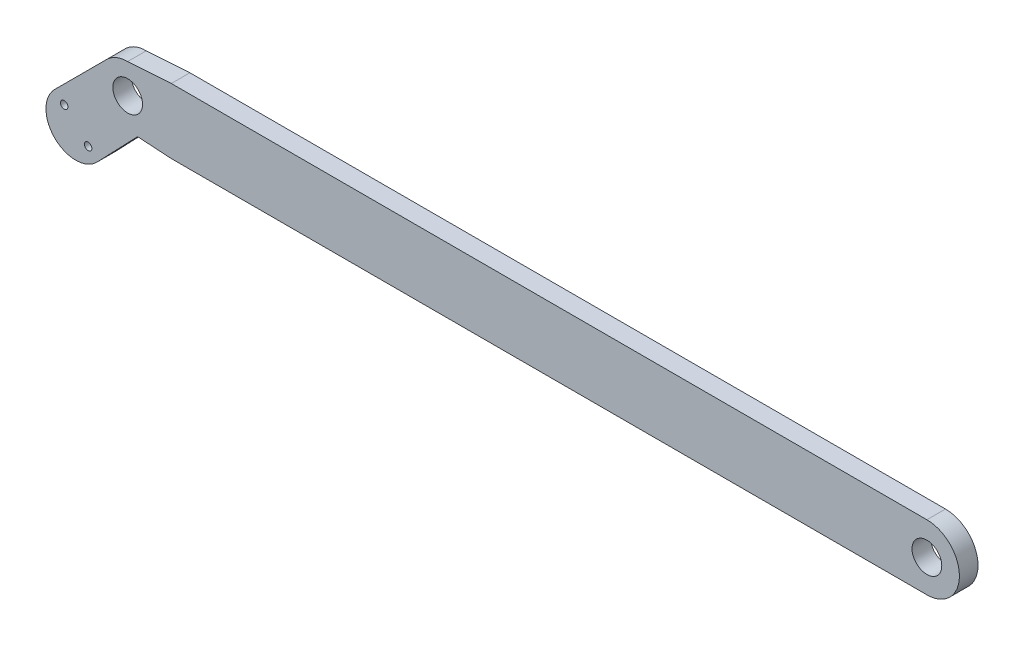
ISO-10303-21;
HEADER;
FILE_DESCRIPTION(('STEP AP214'),'2;1');
FILE_NAME('part.step','',(''),(''),'','','');
FILE_SCHEMA(('AUTOMOTIVE_DESIGN { 1 0 10303 214 1 1 1 1 }'));
ENDSEC;
DATA;
#1=APPLICATION_CONTEXT('core data for automotive mechanical design processes');
#2=APPLICATION_PROTOCOL_DEFINITION('international standard','automotive_design',2000,#1);
#3=PRODUCT_CONTEXT('',#1,'mechanical');
#4=PRODUCT('Part','Part','',(#3));
#5=PRODUCT_RELATED_PRODUCT_CATEGORY('part','',(#4));
#6=PRODUCT_DEFINITION_FORMATION('','',#4);
#7=PRODUCT_DEFINITION_CONTEXT('part definition',#1,'design');
#8=PRODUCT_DEFINITION('design','',#6,#7);
#9=PRODUCT_DEFINITION_SHAPE('','',#8);
#10=(LENGTH_UNIT() NAMED_UNIT(*) SI_UNIT(.MILLI.,.METRE.));
#11=(NAMED_UNIT(*) PLANE_ANGLE_UNIT() SI_UNIT($,.RADIAN.));
#12=(NAMED_UNIT(*) SI_UNIT($,.STERADIAN.) SOLID_ANGLE_UNIT());
#13=UNCERTAINTY_MEASURE_WITH_UNIT(LENGTH_MEASURE(1.E-05),#10,'distance_accuracy_value','');
#14=(GEOMETRIC_REPRESENTATION_CONTEXT(3) GLOBAL_UNCERTAINTY_ASSIGNED_CONTEXT((#13)) GLOBAL_UNIT_ASSIGNED_CONTEXT((#10,
#11,#12)) REPRESENTATION_CONTEXT('',''));
#15=CARTESIAN_POINT('',(0.,0.,0.));
#16=DIRECTION('',(0.,0.,1.));
#17=DIRECTION('',(1.,0.,0.));
#18=AXIS2_PLACEMENT_3D('',#15,#16,#17);
#19=CARTESIAN_POINT('',(-11.7408320292823,0.,5.));
#20=DIRECTION('',(0.,0.,-1.));
#21=DIRECTION('',(-1.,0.,0.));
#22=AXIS2_PLACEMENT_3D('',#19,#20,#21);
#23=CYLINDRICAL_SURFACE('',#22,8.);
#24=DIRECTION('',(0.,0.,-1.));
#25=VECTOR('',#24,1.);
#26=CARTESIAN_POINT('',(-17.4000667674121,5.65447275868802,5.));
#27=LINE('',#26,#25);
#28=CARTESIAN_POINT('',(-17.4000667674121,5.65447275868802,5.));
#29=VERTEX_POINT('',#28);
#30=CARTESIAN_POINT('',(-17.4000667674121,5.65447275868802,0.));
#31=VERTEX_POINT('',#30);
#32=EDGE_CURVE('E175',#29,#31,#27,.T.);
#33=ORIENTED_EDGE('',*,*,#32,.F.);
#34=CARTESIAN_POINT('',(-11.7408320292823,0.,5.));
#35=DIRECTION('',(0.,0.,1.));
#36=DIRECTION('',(1.,0.,0.));
#37=AXIS2_PLACEMENT_3D('',#34,#35,#36);
#38=CIRCLE('',#37,8.);
#39=CARTESIAN_POINT('',(-11.7408320292823,8.,5.));
#40=VERTEX_POINT('',#39);
#41=EDGE_CURVE('E129',#40,#29,#38,.T.);
#42=ORIENTED_EDGE('',*,*,#41,.F.);
#43=DIRECTION('',(0.,0.,-1.));
#44=VECTOR('',#43,1.);
#45=CARTESIAN_POINT('',(-11.7408320292823,8.,5.));
#46=LINE('',#45,#44);
#47=CARTESIAN_POINT('',(-11.7408320292823,8.,0.));
#48=VERTEX_POINT('',#47);
#49=EDGE_CURVE('E124',#40,#48,#46,.T.);
#50=ORIENTED_EDGE('',*,*,#49,.T.);
#51=CARTESIAN_POINT('',(-11.7408320292823,0.,0.));
#52=DIRECTION('',(0.,0.,1.));
#53=DIRECTION('',(1.,0.,0.));
#54=AXIS2_PLACEMENT_3D('',#51,#52,#53);
#55=CIRCLE('',#54,8.);
#56=EDGE_CURVE('E149',#48,#31,#55,.T.);
#57=ORIENTED_EDGE('',*,*,#56,.T.);
#58=EDGE_LOOP('',(#33,#42,#50,#57));
#59=FACE_BOUND('',#58,.T.);
#60=ADVANCED_FACE('F47',(#59),#23,.T.);
#61=CARTESIAN_POINT('',(-0.556705934072331,-8.71447445264226,5.));
#62=DIRECTION('',(-0.0637529476625695,-0.997965711667657,0.));
#63=DIRECTION('',(0.997965711667657,-0.0637529476625695,0.));
#64=AXIS2_PLACEMENT_3D('',#61,#62,#63);
#65=PLANE('',#64);
#66=DIRECTION('',(-0.997965711667657,0.0637529476625695,0.));
#67=VECTOR('',#66,1.);
#68=CARTESIAN_POINT('',(-0.556705934072331,-8.71447445264226,5.));
#69=LINE('',#68,#67);
#70=CARTESIAN_POINT('',(7.45449875131523E-12,-8.75003844433444,5.));
#71=VERTEX_POINT('',#70);
#72=CARTESIAN_POINT('',(-9.08170530878699,-8.16987273676626,5.));
#73=VERTEX_POINT('',#72);
#74=EDGE_CURVE('E132',#71,#73,#69,.T.);
#75=ORIENTED_EDGE('',*,*,#74,.T.);
#76=DIRECTION('',(0.,0.,-1.));
#77=VECTOR('',#76,1.);
#78=CARTESIAN_POINT('',(-9.08170530878699,-8.16987273676626,5.));
#79=LINE('',#78,#77);
#80=CARTESIAN_POINT('',(-9.08170530878699,-8.16987273676626,0.));
#81=VERTEX_POINT('',#80);
#82=EDGE_CURVE('E213',#73,#81,#79,.T.);
#83=ORIENTED_EDGE('',*,*,#82,.T.);
#84=DIRECTION('',(-0.997965711667657,0.0637529476625695,0.));
#85=VECTOR('',#84,1.);
#86=CARTESIAN_POINT('',(-0.556705934072331,-8.71447445264226,0.));
#87=LINE('',#86,#85);
#88=CARTESIAN_POINT('',(7.45449875131523E-12,-8.75003844433444,0.));
#89=VERTEX_POINT('',#88);
#90=EDGE_CURVE('E153',#89,#81,#87,.T.);
#91=ORIENTED_EDGE('',*,*,#90,.F.);
#92=DIRECTION('',(0.,0.,-1.));
#93=VECTOR('',#92,1.);
#94=CARTESIAN_POINT('',(7.45449875131523E-12,-8.75003844433444,5.));
#95=LINE('',#94,#93);
#96=EDGE_CURVE('E65',#71,#89,#95,.T.);
#97=ORIENTED_EDGE('',*,*,#96,.F.);
#98=EDGE_LOOP('',(#75,#83,#91,#97));
#99=FACE_BOUND('',#98,.T.);
#100=ADVANCED_FACE('F219',(#99),#65,.T.);
#101=CARTESIAN_POINT('',(1.56460188089036E-06,-8.75003844433416,5.));
#102=DIRECTION('',(-1.7881085790011E-07,0.999999999999984,0.));
#103=DIRECTION('',(-0.999999999999984,-1.7881085790011E-07,0.));
#104=AXIS2_PLACEMENT_3D('',#101,#102,#103);
#105=PLANE('',#104);
#106=DIRECTION('',(0.999999999999984,1.7881085790011E-07,0.));
#107=VECTOR('',#106,1.);
#108=CARTESIAN_POINT('',(1.56460188089036E-06,-8.75003844433416,0.));
#109=LINE('',#108,#107);
#110=CARTESIAN_POINT('',(203.259167970718,-8.75000209938824,0.));
#111=VERTEX_POINT('',#110);
#112=EDGE_CURVE('E138',#89,#111,#109,.T.);
#113=ORIENTED_EDGE('',*,*,#112,.T.);
#114=DIRECTION('',(0.,0.,-1.));
#115=VECTOR('',#114,1.);
#116=CARTESIAN_POINT('',(203.259167970718,-8.75000209938824,5.));
#117=LINE('',#116,#115);
#118=CARTESIAN_POINT('',(203.259167970718,-8.75000209938824,5.));
#119=VERTEX_POINT('',#118);
#120=EDGE_CURVE('E11',#119,#111,#117,.T.);
#121=ORIENTED_EDGE('',*,*,#120,.F.);
#122=DIRECTION('',(0.999999999999984,1.7881085790011E-07,0.));
#123=VECTOR('',#122,1.);
#124=CARTESIAN_POINT('',(1.56460188089036E-06,-8.75003844433416,5.));
#125=LINE('',#124,#123);
#126=EDGE_CURVE('E157',#71,#119,#125,.T.);
#127=ORIENTED_EDGE('',*,*,#126,.F.);
#128=ORIENTED_EDGE('',*,*,#96,.T.);
#129=EDGE_LOOP('',(#113,#121,#127,#128));
#130=FACE_BOUND('',#129,.T.);
#131=ADVANCED_FACE('F49',(#130),#105,.F.);
#132=CARTESIAN_POINT('',(203.259167970718,-2.09938810414106E-06,5.));
#133=DIRECTION('',(0.,0.,-1.));
#134=DIRECTION('',(-1.,0.,0.));
#135=AXIS2_PLACEMENT_3D('',#132,#133,#134);
#136=CYLINDRICAL_SURFACE('',#135,8.75);
#137=CARTESIAN_POINT('',(203.259167970718,-2.09938810414106E-06,0.));
#138=DIRECTION('',(0.,0.,1.));
#139=DIRECTION('',(1.,0.,0.));
#140=AXIS2_PLACEMENT_3D('',#137,#138,#139);
#141=CIRCLE('',#140,8.75);
#142=CARTESIAN_POINT('',(203.259167970718,8.7499979006119,0.));
#143=VERTEX_POINT('',#142);
#144=EDGE_CURVE('E141',#111,#143,#141,.T.);
#145=ORIENTED_EDGE('',*,*,#144,.T.);
#146=DIRECTION('',(0.,0.,-1.));
#147=VECTOR('',#146,1.);
#148=CARTESIAN_POINT('',(203.259167970718,8.7499979006119,5.));
#149=LINE('',#148,#147);
#150=CARTESIAN_POINT('',(203.259167970718,8.7499979006119,5.));
#151=VERTEX_POINT('',#150);
#152=EDGE_CURVE('E57',#151,#143,#149,.T.);
#153=ORIENTED_EDGE('',*,*,#152,.F.);
#154=CARTESIAN_POINT('',(203.259167970718,-2.09938810414106E-06,5.));
#155=DIRECTION('',(0.,0.,1.));
#156=DIRECTION('',(1.,0.,0.));
#157=AXIS2_PLACEMENT_3D('',#154,#155,#156);
#158=CIRCLE('',#157,8.75);
#159=EDGE_CURVE('E99',#119,#151,#158,.T.);
#160=ORIENTED_EDGE('',*,*,#159,.F.);
#161=ORIENTED_EDGE('',*,*,#120,.T.);
#162=EDGE_LOOP('',(#145,#153,#160,#161));
#163=FACE_BOUND('',#162,.T.);
#164=ADVANCED_FACE('F227',(#163),#136,.T.);
#165=CARTESIAN_POINT('',(0.,8.74999790061187,5.));
#166=DIRECTION('',(0.,-1.,0.));
#167=DIRECTION('',(1.,0.,0.));
#168=AXIS2_PLACEMENT_3D('',#165,#166,#167);
#169=PLANE('',#168);
#170=DIRECTION('',(-1.,0.,0.));
#171=VECTOR('',#170,1.);
#172=CARTESIAN_POINT('',(0.,8.74999790061187,0.));
#173=LINE('',#172,#171);
#174=CARTESIAN_POINT('',(0.,8.74999790061187,0.));
#175=VERTEX_POINT('',#174);
#176=EDGE_CURVE('E122',#143,#175,#173,.T.);
#177=ORIENTED_EDGE('',*,*,#176,.T.);
#178=DIRECTION('',(0.,0.,-1.));
#179=VECTOR('',#178,1.);
#180=CARTESIAN_POINT('',(0.,8.74999790061187,5.));
#181=LINE('',#180,#179);
#182=CARTESIAN_POINT('',(0.,8.74999790061187,5.));
#183=VERTEX_POINT('',#182);
#184=EDGE_CURVE('E119',#183,#175,#181,.T.);
#185=ORIENTED_EDGE('',*,*,#184,.F.);
#186=DIRECTION('',(-1.,0.,0.));
#187=VECTOR('',#186,1.);
#188=CARTESIAN_POINT('',(0.,8.74999790061187,5.));
#189=LINE('',#188,#187);
#190=EDGE_CURVE('E108',#151,#183,#189,.T.);
#191=ORIENTED_EDGE('',*,*,#190,.F.);
#192=ORIENTED_EDGE('',*,*,#152,.T.);
#193=EDGE_LOOP('',(#177,#185,#191,#192));
#194=FACE_BOUND('',#193,.T.);
#195=ADVANCED_FACE('F120',(#194),#169,.F.);
#196=CARTESIAN_POINT('',(-0.55667350625815,8.71443790282138,5.));
#197=DIRECTION('',(0.0637495154692273,-0.997965930920209,0.));
#198=DIRECTION('',(0.997965930920209,0.0637495154692273,0.));
#199=AXIS2_PLACEMENT_3D('',#196,#197,#198);
#200=PLANE('',#199);
#201=DIRECTION('',(-0.997965930920209,-0.0637495154692273,0.));
#202=VECTOR('',#201,1.);
#203=CARTESIAN_POINT('',(-0.55667350625815,8.71443790282138,0.));
#204=LINE('',#203,#202);
#205=EDGE_CURVE('E87',#175,#48,#204,.T.);
#206=ORIENTED_EDGE('',*,*,#205,.T.);
#207=ORIENTED_EDGE('',*,*,#49,.F.);
#208=DIRECTION('',(-0.997965930920209,-0.0637495154692273,0.));
#209=VECTOR('',#208,1.);
#210=CARTESIAN_POINT('',(-0.55667350625815,8.71443790282138,5.));
#211=LINE('',#210,#209);
#212=EDGE_CURVE('E114',#183,#40,#211,.T.);
#213=ORIENTED_EDGE('',*,*,#212,.F.);
#214=ORIENTED_EDGE('',*,*,#184,.T.);
#215=EDGE_LOOP('',(#206,#207,#213,#214));
#216=FACE_BOUND('',#215,.T.);
#217=ADVANCED_FACE('F126',(#216),#200,.F.);
#218=CARTESIAN_POINT('',(0.,0.,5.));
#219=DIRECTION('',(0.,0.,1.));
#220=DIRECTION('',(1.,0.,0.));
#221=AXIS2_PLACEMENT_3D('',#218,#219,#220);
#222=PLANE('',#221);
#223=CARTESIAN_POINT('',(-11.7408320292823,0.,5.));
#224=DIRECTION('',(0.,0.,1.));
#225=DIRECTION('',(1.,0.,0.));
#226=AXIS2_PLACEMENT_3D('',#223,#224,#225);
#227=CIRCLE('',#226,4.);
#228=CARTESIAN_POINT('',(-7.74083202928227,0.,5.));
#229=VERTEX_POINT('',#228);
#230=EDGE_CURVE('E264',#229,#229,#227,.T.);
#231=ORIENTED_EDGE('',*,*,#230,.F.);
#232=EDGE_LOOP('',(#231));
#233=FACE_BOUND('',#232,.T.);
#234=CARTESIAN_POINT('',(203.259167970718,-2.09938810414106E-06,5.));
#235=DIRECTION('',(0.,0.,1.));
#236=DIRECTION('',(1.,0.,0.));
#237=AXIS2_PLACEMENT_3D('',#234,#235,#236);
#238=CIRCLE('',#237,3.99999999999999);
#239=CARTESIAN_POINT('',(207.259167970718,-2.09938810414106E-06,5.));
#240=VERTEX_POINT('',#239);
#241=EDGE_CURVE('E268',#240,#240,#238,.T.);
#242=ORIENTED_EDGE('',*,*,#241,.F.);
#243=EDGE_LOOP('',(#242));
#244=FACE_BOUND('',#243,.T.);
#245=ORIENTED_EDGE('',*,*,#126,.T.);
#246=ORIENTED_EDGE('',*,*,#159,.T.);
#247=ORIENTED_EDGE('',*,*,#190,.T.);
#248=ORIENTED_EDGE('',*,*,#212,.T.);
#249=ORIENTED_EDGE('',*,*,#41,.T.);
#250=DIRECTION('',(0.707106806528035,0.707106755845059,0.));
#251=VECTOR('',#250,1.);
#252=CARTESIAN_POINT('',(-11.5272691394616,11.5272699656966,5.));
#253=LINE('',#252,#251);
#254=CARTESIAN_POINT('',(-31.3818651557126,-8.3273246274454,5.));
#255=VERTEX_POINT('',#254);
#256=EDGE_CURVE('E200',#255,#29,#253,.T.);
#257=ORIENTED_EDGE('',*,*,#256,.F.);
#258=CARTESIAN_POINT('',(-25.7250111089521,-13.9841790796697,5.));
#259=DIRECTION('',(0.,0.,1.));
#260=DIRECTION('',(1.,0.,0.));
#261=AXIS2_PLACEMENT_3D('',#258,#259,#260);
#262=CIRCLE('',#261,8.);
#263=CARTESIAN_POINT('',(-19.9467528899671,-19.5169660767203,5.));
#264=VERTEX_POINT('',#263);
#265=EDGE_CURVE('E206',#255,#264,#262,.T.);
#266=ORIENTED_EDGE('',*,*,#265,.T.);
#267=DIRECTION('',(0.691598374631325,0.722282277373126,0.));
#268=VECTOR('',#267,1.);
#269=CARTESIAN_POINT('',(-0.656759781260251,0.628859396764862,5.));
#270=LINE('',#269,#268);
#271=EDGE_CURVE('E209',#264,#73,#270,.T.);
#272=ORIENTED_EDGE('',*,*,#271,.T.);
#273=ORIENTED_EDGE('',*,*,#74,.F.);
#274=EDGE_LOOP('',(#245,#246,#247,#248,#249,#257,#266,#272,#273));
#275=FACE_BOUND('',#274,.T.);
#276=CARTESIAN_POINT('',(-28.8185162498267,-10.6340298389707,5.));
#277=DIRECTION('',(0.,0.,1.));
#278=DIRECTION('',(1.,0.,0.));
#279=AXIS2_PLACEMENT_3D('',#276,#277,#278);
#280=CIRCLE('',#279,1.);
#281=CARTESIAN_POINT('',(-27.8185162498267,-10.6340298389707,5.));
#282=VERTEX_POINT('',#281);
#283=EDGE_CURVE('E211',#282,#282,#280,.T.);
#284=ORIENTED_EDGE('',*,*,#283,.F.);
#285=EDGE_LOOP('',(#284));
#286=FACE_BOUND('',#285,.T.);
#287=CARTESIAN_POINT('',(-22.3748618682532,-17.0776842205443,5.));
#288=DIRECTION('',(0.,0.,1.));
#289=DIRECTION('',(1.,0.,0.));
#290=AXIS2_PLACEMENT_3D('',#287,#288,#289);
#291=CIRCLE('',#290,1.);
#292=CARTESIAN_POINT('',(-21.3748618682532,-17.0776842205443,5.));
#293=VERTEX_POINT('',#292);
#294=EDGE_CURVE('E217',#293,#293,#291,.F.);
#295=ORIENTED_EDGE('',*,*,#294,.T.);
#296=EDGE_LOOP('',(#295));
#297=FACE_BOUND('',#296,.T.);
#298=ADVANCED_FACE('F110',(#233,#244,#275,#286,#297),#222,.T.);
#299=CARTESIAN_POINT('',(0.,0.,0.));
#300=DIRECTION('',(0.,0.,1.));
#301=DIRECTION('',(1.,0.,0.));
#302=AXIS2_PLACEMENT_3D('',#299,#300,#301);
#303=PLANE('',#302);
#304=CARTESIAN_POINT('',(-11.7408320292823,0.,0.));
#305=DIRECTION('',(0.,0.,1.));
#306=DIRECTION('',(1.,0.,0.));
#307=AXIS2_PLACEMENT_3D('',#304,#305,#306);
#308=CIRCLE('',#307,4.);
#309=CARTESIAN_POINT('',(-7.74083202928227,0.,0.));
#310=VERTEX_POINT('',#309);
#311=EDGE_CURVE('E142',#310,#310,#308,.T.);
#312=ORIENTED_EDGE('',*,*,#311,.T.);
#313=EDGE_LOOP('',(#312));
#314=FACE_BOUND('',#313,.T.);
#315=CARTESIAN_POINT('',(203.259167970718,-2.09938810414106E-06,0.));
#316=DIRECTION('',(0.,0.,1.));
#317=DIRECTION('',(1.,0.,0.));
#318=AXIS2_PLACEMENT_3D('',#315,#316,#317);
#319=CIRCLE('',#318,3.99999999999999);
#320=CARTESIAN_POINT('',(207.259167970718,-2.09938810414106E-06,0.));
#321=VERTEX_POINT('',#320);
#322=EDGE_CURVE('E260',#321,#321,#319,.T.);
#323=ORIENTED_EDGE('',*,*,#322,.T.);
#324=EDGE_LOOP('',(#323));
#325=FACE_BOUND('',#324,.T.);
#326=ORIENTED_EDGE('',*,*,#112,.F.);
#327=ORIENTED_EDGE('',*,*,#90,.T.);
#328=DIRECTION('',(0.691598374631325,0.722282277373126,0.));
#329=VECTOR('',#328,1.);
#330=CARTESIAN_POINT('',(-0.656759781260251,0.628859396764862,0.));
#331=LINE('',#330,#329);
#332=CARTESIAN_POINT('',(-19.9467528899671,-19.5169660767203,0.));
#333=VERTEX_POINT('',#332);
#334=EDGE_CURVE('E194',#333,#81,#331,.T.);
#335=ORIENTED_EDGE('',*,*,#334,.F.);
#336=CARTESIAN_POINT('',(-25.7250111089521,-13.9841790796697,0.));
#337=DIRECTION('',(0.,0.,1.));
#338=DIRECTION('',(1.,0.,0.));
#339=AXIS2_PLACEMENT_3D('',#336,#337,#338);
#340=CIRCLE('',#339,8.);
#341=CARTESIAN_POINT('',(-31.3818651557126,-8.3273246274454,0.));
#342=VERTEX_POINT('',#341);
#343=EDGE_CURVE('E188',#342,#333,#340,.T.);
#344=ORIENTED_EDGE('',*,*,#343,.F.);
#345=DIRECTION('',(0.707106806528035,0.707106755845059,0.));
#346=VECTOR('',#345,1.);
#347=CARTESIAN_POINT('',(-11.5272691394616,11.5272699656966,0.));
#348=LINE('',#347,#346);
#349=EDGE_CURVE('E170',#342,#31,#348,.T.);
#350=ORIENTED_EDGE('',*,*,#349,.T.);
#351=ORIENTED_EDGE('',*,*,#56,.F.);
#352=ORIENTED_EDGE('',*,*,#205,.F.);
#353=ORIENTED_EDGE('',*,*,#176,.F.);
#354=ORIENTED_EDGE('',*,*,#144,.F.);
#355=EDGE_LOOP('',(#326,#327,#335,#344,#350,#351,#352,#353,#354));
#356=FACE_BOUND('',#355,.T.);
#357=CARTESIAN_POINT('',(-28.8185162498267,-10.6340298389707,0.));
#358=DIRECTION('',(0.,0.,1.));
#359=DIRECTION('',(1.,0.,0.));
#360=AXIS2_PLACEMENT_3D('',#357,#358,#359);
#361=CIRCLE('',#360,1.);
#362=CARTESIAN_POINT('',(-27.8185162498267,-10.6340298389707,0.));
#363=VERTEX_POINT('',#362);
#364=EDGE_CURVE('E240',#363,#363,#361,.T.);
#365=ORIENTED_EDGE('',*,*,#364,.T.);
#366=EDGE_LOOP('',(#365));
#367=FACE_BOUND('',#366,.T.);
#368=CARTESIAN_POINT('',(-22.3748618682532,-17.0776842205443,0.));
#369=DIRECTION('',(0.,0.,1.));
#370=DIRECTION('',(1.,0.,0.));
#371=AXIS2_PLACEMENT_3D('',#368,#369,#370);
#372=CIRCLE('',#371,1.);
#373=CARTESIAN_POINT('',(-21.3748618682532,-17.0776842205443,0.));
#374=VERTEX_POINT('',#373);
#375=EDGE_CURVE('E245',#374,#374,#372,.F.);
#376=ORIENTED_EDGE('',*,*,#375,.F.);
#377=EDGE_LOOP('',(#376));
#378=FACE_BOUND('',#377,.T.);
#379=ADVANCED_FACE('F163',(#314,#325,#356,#367,#378),#303,.F.);
#380=CARTESIAN_POINT('',(203.259167970718,-2.09938810414106E-06,0.));
#381=DIRECTION('',(0.,0.,1.));
#382=DIRECTION('',(1.,0.,0.));
#383=AXIS2_PLACEMENT_3D('',#380,#381,#382);
#384=CYLINDRICAL_SURFACE('',#383,3.99999999999999);
#385=ORIENTED_EDGE('',*,*,#322,.F.);
#386=EDGE_LOOP('',(#385));
#387=FACE_BOUND('',#386,.T.);
#388=ORIENTED_EDGE('',*,*,#241,.T.);
#389=EDGE_LOOP('',(#388));
#390=FACE_BOUND('',#389,.T.);
#391=ADVANCED_FACE('F303',(#387,#390),#384,.F.);
#392=CARTESIAN_POINT('',(-11.7408320292823,0.,0.));
#393=DIRECTION('',(0.,0.,1.));
#394=DIRECTION('',(1.,0.,0.));
#395=AXIS2_PLACEMENT_3D('',#392,#393,#394);
#396=CYLINDRICAL_SURFACE('',#395,4.);
#397=ORIENTED_EDGE('',*,*,#311,.F.);
#398=EDGE_LOOP('',(#397));
#399=FACE_BOUND('',#398,.T.);
#400=ORIENTED_EDGE('',*,*,#230,.T.);
#401=EDGE_LOOP('',(#400));
#402=FACE_BOUND('',#401,.T.);
#403=ADVANCED_FACE('F309',(#399,#402),#396,.F.);
#404=CARTESIAN_POINT('',(-11.5272691394616,11.5272699656966,5.));
#405=DIRECTION('',(-0.707106755845059,0.707106806528035,0.));
#406=DIRECTION('',(-0.707106806528035,-0.707106755845059,0.));
#407=AXIS2_PLACEMENT_3D('',#404,#405,#406);
#408=PLANE('',#407);
#409=ORIENTED_EDGE('',*,*,#349,.F.);
#410=DIRECTION('',(0.,0.,-1.));
#411=VECTOR('',#410,1.);
#412=CARTESIAN_POINT('',(-31.3818651557126,-8.3273246274454,5.));
#413=LINE('',#412,#411);
#414=EDGE_CURVE('E255',#255,#342,#413,.T.);
#415=ORIENTED_EDGE('',*,*,#414,.F.);
#416=ORIENTED_EDGE('',*,*,#256,.T.);
#417=ORIENTED_EDGE('',*,*,#32,.T.);
#418=EDGE_LOOP('',(#409,#415,#416,#417));
#419=FACE_BOUND('',#418,.T.);
#420=ADVANCED_FACE('F321',(#419),#408,.T.);
#421=CARTESIAN_POINT('',(-25.7250111089521,-13.9841790796697,5.));
#422=DIRECTION('',(0.,0.,-1.));
#423=DIRECTION('',(-1.,0.,0.));
#424=AXIS2_PLACEMENT_3D('',#421,#422,#423);
#425=CYLINDRICAL_SURFACE('',#424,8.);
#426=ORIENTED_EDGE('',*,*,#343,.T.);
#427=DIRECTION('',(0.,0.,-1.));
#428=VECTOR('',#427,1.);
#429=CARTESIAN_POINT('',(-19.9467528899671,-19.5169660767203,5.));
#430=LINE('',#429,#428);
#431=EDGE_CURVE('E216',#264,#333,#430,.T.);
#432=ORIENTED_EDGE('',*,*,#431,.F.);
#433=ORIENTED_EDGE('',*,*,#265,.F.);
#434=ORIENTED_EDGE('',*,*,#414,.T.);
#435=EDGE_LOOP('',(#426,#432,#433,#434));
#436=FACE_BOUND('',#435,.T.);
#437=ADVANCED_FACE('F326',(#436),#425,.T.);
#438=CARTESIAN_POINT('',(-0.656759781260251,0.628859396764862,5.));
#439=DIRECTION('',(-0.722282277373126,0.691598374631325,0.));
#440=DIRECTION('',(-0.691598374631325,-0.722282277373126,0.));
#441=AXIS2_PLACEMENT_3D('',#438,#439,#440);
#442=PLANE('',#441);
#443=ORIENTED_EDGE('',*,*,#334,.T.);
#444=ORIENTED_EDGE('',*,*,#82,.F.);
#445=ORIENTED_EDGE('',*,*,#271,.F.);
#446=ORIENTED_EDGE('',*,*,#431,.T.);
#447=EDGE_LOOP('',(#443,#444,#445,#446));
#448=FACE_BOUND('',#447,.T.);
#449=ADVANCED_FACE('F214',(#448),#442,.F.);
#450=CARTESIAN_POINT('',(-28.8185162498267,-10.6340298389707,5.));
#451=DIRECTION('',(0.,0.,-1.));
#452=DIRECTION('',(-1.,0.,0.));
#453=AXIS2_PLACEMENT_3D('',#450,#451,#452);
#454=CYLINDRICAL_SURFACE('',#453,1.);
#455=ORIENTED_EDGE('',*,*,#283,.T.);
#456=EDGE_LOOP('',(#455));
#457=FACE_BOUND('',#456,.T.);
#458=ORIENTED_EDGE('',*,*,#364,.F.);
#459=EDGE_LOOP('',(#458));
#460=FACE_BOUND('',#459,.T.);
#461=ADVANCED_FACE('F290',(#457,#460),#454,.F.);
#462=CARTESIAN_POINT('',(-22.3748618682532,-17.0776842205443,5.));
#463=DIRECTION('',(0.,0.,-1.));
#464=DIRECTION('',(-1.,0.,0.));
#465=AXIS2_PLACEMENT_3D('',#462,#463,#464);
#466=CYLINDRICAL_SURFACE('',#465,1.);
#467=ORIENTED_EDGE('',*,*,#294,.F.);
#468=EDGE_LOOP('',(#467));
#469=FACE_BOUND('',#468,.T.);
#470=ORIENTED_EDGE('',*,*,#375,.T.);
#471=EDGE_LOOP('',(#470));
#472=FACE_BOUND('',#471,.T.);
#473=ADVANCED_FACE('F296',(#469,#472),#466,.F.);
#474=CLOSED_SHELL('',(#60,#100,#131,#164,#195,#217,#298,#379,#391,#403,#420,#437,#449,#461,#473));
#475=MANIFOLD_SOLID_BREP('B2',#474);
#476=ADVANCED_BREP_SHAPE_REPRESENTATION('',(#18,#475),#14);
#477=SHAPE_DEFINITION_REPRESENTATION(#9,#476);
ENDSEC;
END-ISO-10303-21;
